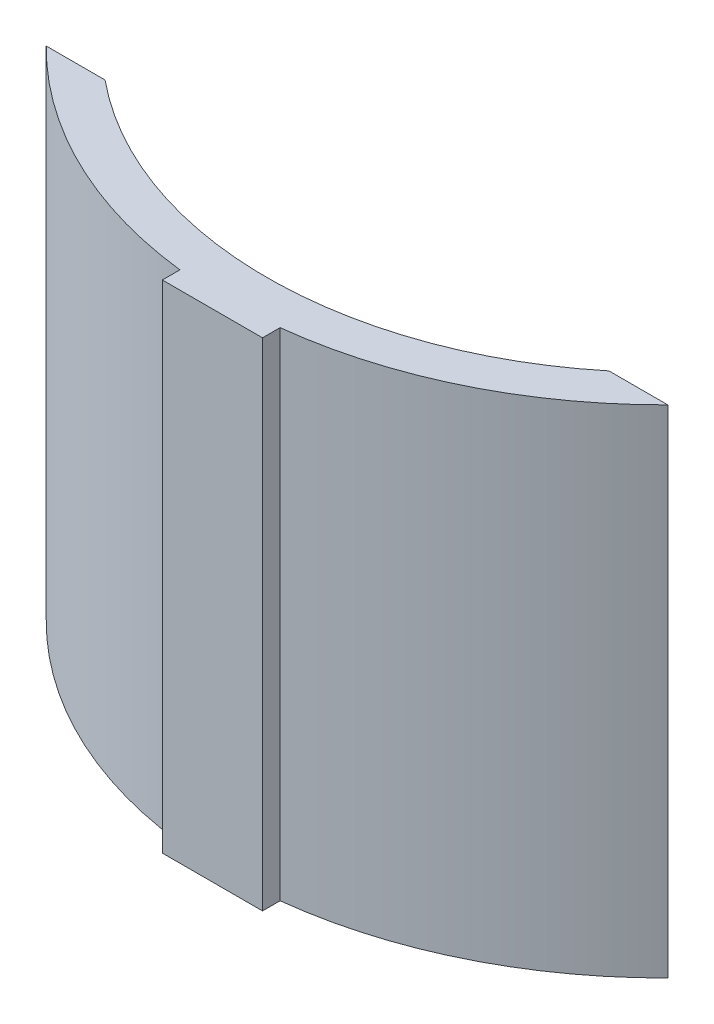
ISO-10303-21;
HEADER;
FILE_DESCRIPTION(('STEP AP214'),'2;1');
FILE_NAME('part.step','',(''),(''),'','','');
FILE_SCHEMA(('AUTOMOTIVE_DESIGN { 1 0 10303 214 1 1 1 1 }'));
ENDSEC;
DATA;
#1=APPLICATION_CONTEXT('core data for automotive mechanical design processes');
#2=APPLICATION_PROTOCOL_DEFINITION('international standard','automotive_design',2000,#1);
#3=PRODUCT_CONTEXT('',#1,'mechanical');
#4=PRODUCT('Part','Part','',(#3));
#5=PRODUCT_RELATED_PRODUCT_CATEGORY('part','',(#4));
#6=PRODUCT_DEFINITION_FORMATION('','',#4);
#7=PRODUCT_DEFINITION_CONTEXT('part definition',#1,'design');
#8=PRODUCT_DEFINITION('design','',#6,#7);
#9=PRODUCT_DEFINITION_SHAPE('','',#8);
#10=(LENGTH_UNIT() NAMED_UNIT(*) SI_UNIT(.MILLI.,.METRE.));
#11=(NAMED_UNIT(*) PLANE_ANGLE_UNIT() SI_UNIT($,.RADIAN.));
#12=(NAMED_UNIT(*) SI_UNIT($,.STERADIAN.) SOLID_ANGLE_UNIT());
#13=UNCERTAINTY_MEASURE_WITH_UNIT(LENGTH_MEASURE(1.E-05),#10,'distance_accuracy_value','');
#14=(GEOMETRIC_REPRESENTATION_CONTEXT(3) GLOBAL_UNCERTAINTY_ASSIGNED_CONTEXT((#13)) GLOBAL_UNIT_ASSIGNED_CONTEXT((#10,
#11,#12)) REPRESENTATION_CONTEXT('',''));
#15=CARTESIAN_POINT('',(0.,0.,0.));
#16=DIRECTION('',(0.,0.,1.));
#17=DIRECTION('',(1.,0.,0.));
#18=AXIS2_PLACEMENT_3D('',#15,#16,#17);
#19=CARTESIAN_POINT('',(0.,25.,0.));
#20=DIRECTION('',(0.,-1.,0.));
#21=DIRECTION('',(0.,0.,-1.));
#22=AXIS2_PLACEMENT_3D('',#19,#20,#21);
#23=CYLINDRICAL_SURFACE('',#22,20.);
#24=CARTESIAN_POINT('',(0.,0.,0.));
#25=DIRECTION('',(0.,-1.,0.));
#26=DIRECTION('',(0.,0.,1.));
#27=AXIS2_PLACEMENT_3D('',#24,#25,#26);
#28=CIRCLE('',#27,20.);
#29=CARTESIAN_POINT('',(12.6893910020882,0.,15.4589571445206));
#30=VERTEX_POINT('',#29);
#31=CARTESIAN_POINT('',(-12.6893910020882,0.,15.4589571445205));
#32=VERTEX_POINT('',#31);
#33=EDGE_CURVE('E129',#30,#32,#28,.T.);
#34=ORIENTED_EDGE('',*,*,#33,.T.);
#35=DIRECTION('',(0.,-1.,0.));
#36=VECTOR('',#35,1.);
#37=CARTESIAN_POINT('',(-12.6893910020882,25.,15.4589571445205));
#38=LINE('',#37,#36);
#39=CARTESIAN_POINT('',(-12.6893910020882,25.,15.4589571445205));
#40=VERTEX_POINT('',#39);
#41=EDGE_CURVE('E11',#40,#32,#38,.T.);
#42=ORIENTED_EDGE('',*,*,#41,.F.);
#43=CARTESIAN_POINT('',(0.,25.,0.));
#44=DIRECTION('',(0.,-1.,0.));
#45=DIRECTION('',(0.,0.,1.));
#46=AXIS2_PLACEMENT_3D('',#43,#44,#45);
#47=CIRCLE('',#46,20.);
#48=CARTESIAN_POINT('',(12.6893910020882,25.,15.4589571445206));
#49=VERTEX_POINT('',#48);
#50=EDGE_CURVE('E143',#49,#40,#47,.T.);
#51=ORIENTED_EDGE('',*,*,#50,.F.);
#52=DIRECTION('',(0.,-1.,0.));
#53=VECTOR('',#52,1.);
#54=CARTESIAN_POINT('',(12.6893910020882,25.,15.4589571445206));
#55=LINE('',#54,#53);
#56=EDGE_CURVE('E125',#49,#30,#55,.T.);
#57=ORIENTED_EDGE('',*,*,#56,.T.);
#58=EDGE_LOOP('',(#34,#42,#51,#57));
#59=FACE_BOUND('',#58,.T.);
#60=ADVANCED_FACE('F33',(#59),#23,.F.);
#61=CARTESIAN_POINT('',(-15.6531352771219,25.,15.4589571445205));
#62=DIRECTION('',(0.,0.,1.));
#63=DIRECTION('',(1.,0.,0.));
#64=AXIS2_PLACEMENT_3D('',#61,#62,#63);
#65=PLANE('',#64);
#66=DIRECTION('',(-1.,0.,0.));
#67=VECTOR('',#66,1.);
#68=CARTESIAN_POINT('',(-15.6531352771219,0.,15.4589571445205));
#69=LINE('',#68,#67);
#70=CARTESIAN_POINT('',(-15.6531352771219,0.,15.4589571445205));
#71=VERTEX_POINT('',#70);
#72=EDGE_CURVE('E132',#32,#71,#69,.T.);
#73=ORIENTED_EDGE('',*,*,#72,.T.);
#74=DIRECTION('',(0.,-1.,0.));
#75=VECTOR('',#74,1.);
#76=CARTESIAN_POINT('',(-15.6531352771219,25.,15.4589571445205));
#77=LINE('',#76,#75);
#78=CARTESIAN_POINT('',(-15.6531352771219,25.,15.4589571445205));
#79=VERTEX_POINT('',#78);
#80=EDGE_CURVE('E41',#79,#71,#77,.T.);
#81=ORIENTED_EDGE('',*,*,#80,.F.);
#82=DIRECTION('',(-1.,0.,0.));
#83=VECTOR('',#82,1.);
#84=CARTESIAN_POINT('',(-15.6531352771219,25.,15.4589571445205));
#85=LINE('',#84,#83);
#86=EDGE_CURVE('E92',#40,#79,#85,.T.);
#87=ORIENTED_EDGE('',*,*,#86,.F.);
#88=ORIENTED_EDGE('',*,*,#41,.T.);
#89=EDGE_LOOP('',(#73,#81,#87,#88));
#90=FACE_BOUND('',#89,.T.);
#91=ADVANCED_FACE('F178',(#90),#65,.F.);
#92=CARTESIAN_POINT('',(0.,25.,0.));
#93=DIRECTION('',(0.,-1.,0.));
#94=DIRECTION('',(0.,0.,-1.));
#95=AXIS2_PLACEMENT_3D('',#92,#93,#94);
#96=CYLINDRICAL_SURFACE('',#95,22.);
#97=CARTESIAN_POINT('',(0.,0.,0.));
#98=DIRECTION('',(0.,1.,0.));
#99=DIRECTION('',(0.,0.,1.));
#100=AXIS2_PLACEMENT_3D('',#97,#98,#99);
#101=CIRCLE('',#100,22.);
#102=CARTESIAN_POINT('',(-2.52256147591696,0.,21.8549006769699));
#103=VERTEX_POINT('',#102);
#104=EDGE_CURVE('E134',#71,#103,#101,.T.);
#105=ORIENTED_EDGE('',*,*,#104,.T.);
#106=DIRECTION('',(0.,-1.,0.));
#107=VECTOR('',#106,1.);
#108=CARTESIAN_POINT('',(-2.52256147591696,25.,21.8549006769699));
#109=LINE('',#108,#107);
#110=CARTESIAN_POINT('',(-2.52256147591696,25.,21.8549006769699));
#111=VERTEX_POINT('',#110);
#112=EDGE_CURVE('E150',#111,#103,#109,.T.);
#113=ORIENTED_EDGE('',*,*,#112,.F.);
#114=CARTESIAN_POINT('',(0.,25.,0.));
#115=DIRECTION('',(0.,1.,0.));
#116=DIRECTION('',(0.,0.,1.));
#117=AXIS2_PLACEMENT_3D('',#114,#115,#116);
#118=CIRCLE('',#117,22.);
#119=EDGE_CURVE('E158',#79,#111,#118,.T.);
#120=ORIENTED_EDGE('',*,*,#119,.F.);
#121=ORIENTED_EDGE('',*,*,#80,.T.);
#122=EDGE_LOOP('',(#105,#113,#120,#121));
#123=FACE_BOUND('',#122,.T.);
#124=ADVANCED_FACE('F156',(#123),#96,.T.);
#125=CARTESIAN_POINT('',(-2.52256147591696,25.,21.8549006769699));
#126=DIRECTION('',(1.,0.,0.));
#127=DIRECTION('',(0.,0.,-1.));
#128=AXIS2_PLACEMENT_3D('',#125,#126,#127);
#129=PLANE('',#128);
#130=DIRECTION('',(0.,0.,1.));
#131=VECTOR('',#130,1.);
#132=CARTESIAN_POINT('',(-2.52256147591696,0.,21.8549006769699));
#133=LINE('',#132,#131);
#134=CARTESIAN_POINT('',(-2.52256147591697,0.,22.740089192746));
#135=VERTEX_POINT('',#134);
#136=EDGE_CURVE('E136',#103,#135,#133,.T.);
#137=ORIENTED_EDGE('',*,*,#136,.T.);
#138=DIRECTION('',(0.,-1.,0.));
#139=VECTOR('',#138,1.);
#140=CARTESIAN_POINT('',(-2.52256147591697,25.,22.740089192746));
#141=LINE('',#140,#139);
#142=CARTESIAN_POINT('',(-2.52256147591697,25.,22.740089192746));
#143=VERTEX_POINT('',#142);
#144=EDGE_CURVE('E147',#143,#135,#141,.T.);
#145=ORIENTED_EDGE('',*,*,#144,.F.);
#146=DIRECTION('',(0.,0.,1.));
#147=VECTOR('',#146,1.);
#148=CARTESIAN_POINT('',(-2.52256147591696,25.,21.8549006769699));
#149=LINE('',#148,#147);
#150=EDGE_CURVE('E170',#111,#143,#149,.T.);
#151=ORIENTED_EDGE('',*,*,#150,.F.);
#152=ORIENTED_EDGE('',*,*,#112,.T.);
#153=EDGE_LOOP('',(#137,#145,#151,#152));
#154=FACE_BOUND('',#153,.T.);
#155=ADVANCED_FACE('F166',(#154),#129,.F.);
#156=CARTESIAN_POINT('',(-2.52256147591697,25.,22.740089192746));
#157=DIRECTION('',(0.,0.,-1.));
#158=DIRECTION('',(-1.,0.,0.));
#159=AXIS2_PLACEMENT_3D('',#156,#157,#158);
#160=PLANE('',#159);
#161=DIRECTION('',(1.,0.,0.));
#162=VECTOR('',#161,1.);
#163=CARTESIAN_POINT('',(-2.52256147591697,0.,22.740089192746));
#164=LINE('',#163,#162);
#165=CARTESIAN_POINT('',(2.52256147591698,0.,22.740089192746));
#166=VERTEX_POINT('',#165);
#167=EDGE_CURVE('E138',#135,#166,#164,.T.);
#168=ORIENTED_EDGE('',*,*,#167,.T.);
#169=DIRECTION('',(0.,-1.,0.));
#170=VECTOR('',#169,1.);
#171=CARTESIAN_POINT('',(2.52256147591698,25.,22.740089192746));
#172=LINE('',#171,#170);
#173=CARTESIAN_POINT('',(2.52256147591698,25.,22.740089192746));
#174=VERTEX_POINT('',#173);
#175=EDGE_CURVE('E120',#174,#166,#172,.T.);
#176=ORIENTED_EDGE('',*,*,#175,.F.);
#177=DIRECTION('',(1.,0.,0.));
#178=VECTOR('',#177,1.);
#179=CARTESIAN_POINT('',(-2.52256147591697,25.,22.740089192746));
#180=LINE('',#179,#178);
#181=EDGE_CURVE('E111',#143,#174,#180,.T.);
#182=ORIENTED_EDGE('',*,*,#181,.F.);
#183=ORIENTED_EDGE('',*,*,#144,.T.);
#184=EDGE_LOOP('',(#168,#176,#182,#183));
#185=FACE_BOUND('',#184,.T.);
#186=ADVANCED_FACE('F169',(#185),#160,.F.);
#187=CARTESIAN_POINT('',(2.52256147591696,25.,21.8549006769699));
#188=DIRECTION('',(-1.,0.,0.));
#189=DIRECTION('',(0.,0.,1.));
#190=AXIS2_PLACEMENT_3D('',#187,#188,#189);
#191=PLANE('',#190);
#192=DIRECTION('',(0.,0.,-1.));
#193=VECTOR('',#192,1.);
#194=CARTESIAN_POINT('',(2.52256147591696,0.,21.8549006769699));
#195=LINE('',#194,#193);
#196=CARTESIAN_POINT('',(2.52256147591696,0.,21.8549006769699));
#197=VERTEX_POINT('',#196);
#198=EDGE_CURVE('E119',#166,#197,#195,.T.);
#199=ORIENTED_EDGE('',*,*,#198,.T.);
#200=DIRECTION('',(0.,-1.,0.));
#201=VECTOR('',#200,1.);
#202=CARTESIAN_POINT('',(2.52256147591696,25.,21.8549006769699));
#203=LINE('',#202,#201);
#204=CARTESIAN_POINT('',(2.52256147591696,25.,21.8549006769699));
#205=VERTEX_POINT('',#204);
#206=EDGE_CURVE('E116',#205,#197,#203,.T.);
#207=ORIENTED_EDGE('',*,*,#206,.F.);
#208=DIRECTION('',(0.,0.,-1.));
#209=VECTOR('',#208,1.);
#210=CARTESIAN_POINT('',(2.52256147591696,25.,21.8549006769699));
#211=LINE('',#210,#209);
#212=EDGE_CURVE('E105',#174,#205,#211,.T.);
#213=ORIENTED_EDGE('',*,*,#212,.F.);
#214=ORIENTED_EDGE('',*,*,#175,.T.);
#215=EDGE_LOOP('',(#199,#207,#213,#214));
#216=FACE_BOUND('',#215,.T.);
#217=ADVANCED_FACE('F117',(#216),#191,.F.);
#218=CARTESIAN_POINT('',(0.,25.,0.));
#219=DIRECTION('',(0.,-1.,0.));
#220=DIRECTION('',(0.,0.,-1.));
#221=AXIS2_PLACEMENT_3D('',#218,#219,#220);
#222=CYLINDRICAL_SURFACE('',#221,22.);
#223=CARTESIAN_POINT('',(0.,0.,0.));
#224=DIRECTION('',(0.,1.,0.));
#225=DIRECTION('',(0.,0.,1.));
#226=AXIS2_PLACEMENT_3D('',#223,#224,#225);
#227=CIRCLE('',#226,22.);
#228=CARTESIAN_POINT('',(15.6531352771219,0.,15.4589571445206));
#229=VERTEX_POINT('',#228);
#230=EDGE_CURVE('E78',#197,#229,#227,.T.);
#231=ORIENTED_EDGE('',*,*,#230,.T.);
#232=DIRECTION('',(0.,-1.,0.));
#233=VECTOR('',#232,1.);
#234=CARTESIAN_POINT('',(15.6531352771219,25.,15.4589571445206));
#235=LINE('',#234,#233);
#236=CARTESIAN_POINT('',(15.6531352771219,25.,15.4589571445206));
#237=VERTEX_POINT('',#236);
#238=EDGE_CURVE('E121',#237,#229,#235,.T.);
#239=ORIENTED_EDGE('',*,*,#238,.F.);
#240=CARTESIAN_POINT('',(0.,25.,0.));
#241=DIRECTION('',(0.,1.,0.));
#242=DIRECTION('',(0.,0.,1.));
#243=AXIS2_PLACEMENT_3D('',#240,#241,#242);
#244=CIRCLE('',#243,22.);
#245=EDGE_CURVE('E109',#205,#237,#244,.T.);
#246=ORIENTED_EDGE('',*,*,#245,.F.);
#247=ORIENTED_EDGE('',*,*,#206,.T.);
#248=EDGE_LOOP('',(#231,#239,#246,#247));
#249=FACE_BOUND('',#248,.T.);
#250=ADVANCED_FACE('F123',(#249),#222,.T.);
#251=CARTESIAN_POINT('',(12.6893910020882,25.,15.4589571445206));
#252=DIRECTION('',(0.,0.,1.));
#253=DIRECTION('',(1.,0.,0.));
#254=AXIS2_PLACEMENT_3D('',#251,#252,#253);
#255=PLANE('',#254);
#256=DIRECTION('',(-1.,0.,0.));
#257=VECTOR('',#256,1.);
#258=CARTESIAN_POINT('',(12.6893910020882,0.,15.4589571445206));
#259=LINE('',#258,#257);
#260=EDGE_CURVE('E84',#229,#30,#259,.T.);
#261=ORIENTED_EDGE('',*,*,#260,.T.);
#262=ORIENTED_EDGE('',*,*,#56,.F.);
#263=DIRECTION('',(-1.,0.,0.));
#264=VECTOR('',#263,1.);
#265=CARTESIAN_POINT('',(12.6893910020882,25.,15.4589571445206));
#266=LINE('',#265,#264);
#267=EDGE_CURVE('E49',#237,#49,#266,.T.);
#268=ORIENTED_EDGE('',*,*,#267,.F.);
#269=ORIENTED_EDGE('',*,*,#238,.T.);
#270=EDGE_LOOP('',(#261,#262,#268,#269));
#271=FACE_BOUND('',#270,.T.);
#272=ADVANCED_FACE('F194',(#271),#255,.F.);
#273=CARTESIAN_POINT('',(0.,25.,0.));
#274=DIRECTION('',(0.,1.,0.));
#275=DIRECTION('',(0.,0.,1.));
#276=AXIS2_PLACEMENT_3D('',#273,#274,#275);
#277=PLANE('',#276);
#278=ORIENTED_EDGE('',*,*,#50,.T.);
#279=ORIENTED_EDGE('',*,*,#86,.T.);
#280=ORIENTED_EDGE('',*,*,#119,.T.);
#281=ORIENTED_EDGE('',*,*,#150,.T.);
#282=ORIENTED_EDGE('',*,*,#181,.T.);
#283=ORIENTED_EDGE('',*,*,#212,.T.);
#284=ORIENTED_EDGE('',*,*,#245,.T.);
#285=ORIENTED_EDGE('',*,*,#267,.T.);
#286=EDGE_LOOP('',(#278,#279,#280,#281,#282,#283,#284,#285));
#287=FACE_BOUND('',#286,.T.);
#288=ADVANCED_FACE('F107',(#287),#277,.T.);
#289=CARTESIAN_POINT('',(0.,0.,0.));
#290=DIRECTION('',(0.,1.,0.));
#291=DIRECTION('',(0.,0.,1.));
#292=AXIS2_PLACEMENT_3D('',#289,#290,#291);
#293=PLANE('',#292);
#294=ORIENTED_EDGE('',*,*,#33,.F.);
#295=ORIENTED_EDGE('',*,*,#260,.F.);
#296=ORIENTED_EDGE('',*,*,#230,.F.);
#297=ORIENTED_EDGE('',*,*,#198,.F.);
#298=ORIENTED_EDGE('',*,*,#167,.F.);
#299=ORIENTED_EDGE('',*,*,#136,.F.);
#300=ORIENTED_EDGE('',*,*,#104,.F.);
#301=ORIENTED_EDGE('',*,*,#72,.F.);
#302=EDGE_LOOP('',(#294,#295,#296,#297,#298,#299,#300,#301));
#303=FACE_BOUND('',#302,.T.);
#304=ADVANCED_FACE('F162',(#303),#293,.F.);
#305=CLOSED_SHELL('',(#60,#91,#124,#155,#186,#217,#250,#272,#288,#304));
#306=MANIFOLD_SOLID_BREP('B2',#305);
#307=ADVANCED_BREP_SHAPE_REPRESENTATION('',(#18,#306),#14);
#308=SHAPE_DEFINITION_REPRESENTATION(#9,#307);
ENDSEC;
END-ISO-10303-21;
